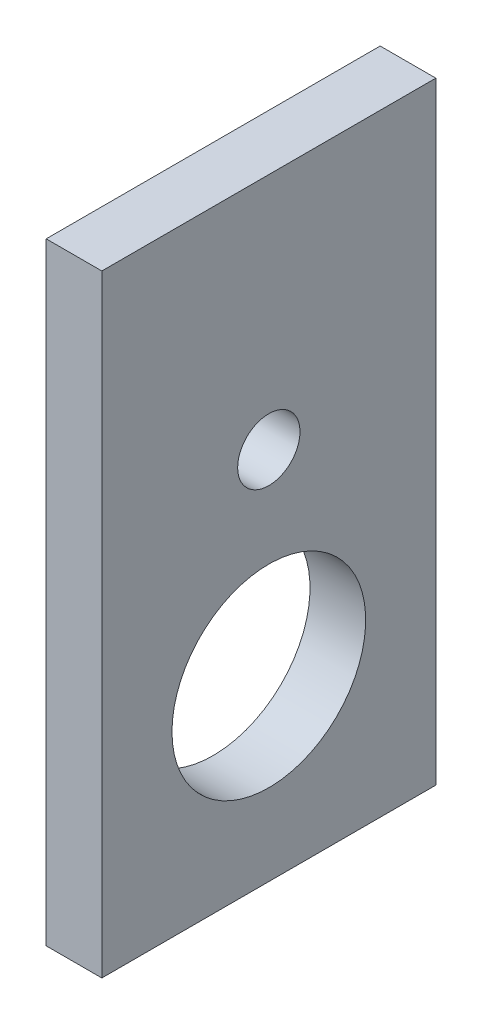
ISO-10303-21;
HEADER;
FILE_DESCRIPTION(('STEP AP214'),'2;1');
FILE_NAME('part.step','',(''),(''),'','','');
FILE_SCHEMA(('AUTOMOTIVE_DESIGN { 1 0 10303 214 1 1 1 1 }'));
ENDSEC;
DATA;
#1=APPLICATION_CONTEXT('core data for automotive mechanical design processes');
#2=APPLICATION_PROTOCOL_DEFINITION('international standard','automotive_design',2000,#1);
#3=PRODUCT_CONTEXT('',#1,'mechanical');
#4=PRODUCT('Part','Part','',(#3));
#5=PRODUCT_RELATED_PRODUCT_CATEGORY('part','',(#4));
#6=PRODUCT_DEFINITION_FORMATION('','',#4);
#7=PRODUCT_DEFINITION_CONTEXT('part definition',#1,'design');
#8=PRODUCT_DEFINITION('design','',#6,#7);
#9=PRODUCT_DEFINITION_SHAPE('','',#8);
#10=(LENGTH_UNIT() NAMED_UNIT(*) SI_UNIT(.MILLI.,.METRE.));
#11=(NAMED_UNIT(*) PLANE_ANGLE_UNIT() SI_UNIT($,.RADIAN.));
#12=(NAMED_UNIT(*) SI_UNIT($,.STERADIAN.) SOLID_ANGLE_UNIT());
#13=UNCERTAINTY_MEASURE_WITH_UNIT(LENGTH_MEASURE(1.E-05),#10,'distance_accuracy_value','');
#14=(GEOMETRIC_REPRESENTATION_CONTEXT(3) GLOBAL_UNCERTAINTY_ASSIGNED_CONTEXT((#13)) GLOBAL_UNIT_ASSIGNED_CONTEXT((#10,
#11,#12)) REPRESENTATION_CONTEXT('',''));
#15=CARTESIAN_POINT('',(0.,0.,0.));
#16=DIRECTION('',(0.,0.,1.));
#17=DIRECTION('',(1.,0.,0.));
#18=AXIS2_PLACEMENT_3D('',#15,#16,#17);
#19=CARTESIAN_POINT('',(0.,0.,38.1));
#20=DIRECTION('',(0.,1.,0.));
#21=DIRECTION('',(0.,0.,1.));
#22=AXIS2_PLACEMENT_3D('',#19,#20,#21);
#23=PLANE('',#22);
#24=DIRECTION('',(1.,0.,0.));
#25=VECTOR('',#24,1.);
#26=CARTESIAN_POINT('',(0.,0.,0.));
#27=LINE('',#26,#25);
#28=CARTESIAN_POINT('',(0.,0.,0.));
#29=VERTEX_POINT('',#28);
#30=CARTESIAN_POINT('',(6.35,0.,0.));
#31=VERTEX_POINT('',#30);
#32=EDGE_CURVE('E69',#29,#31,#27,.T.);
#33=ORIENTED_EDGE('',*,*,#32,.T.);
#34=DIRECTION('',(0.,0.,-1.));
#35=VECTOR('',#34,1.);
#36=CARTESIAN_POINT('',(6.35,0.,38.1));
#37=LINE('',#36,#35);
#38=CARTESIAN_POINT('',(6.35,0.,38.1));
#39=VERTEX_POINT('',#38);
#40=EDGE_CURVE('E41',#39,#31,#37,.T.);
#41=ORIENTED_EDGE('',*,*,#40,.F.);
#42=DIRECTION('',(1.,0.,0.));
#43=VECTOR('',#42,1.);
#44=CARTESIAN_POINT('',(0.,0.,38.1));
#45=LINE('',#44,#43);
#46=CARTESIAN_POINT('',(0.,0.,38.1));
#47=VERTEX_POINT('',#46);
#48=EDGE_CURVE('E71',#47,#39,#45,.T.);
#49=ORIENTED_EDGE('',*,*,#48,.F.);
#50=DIRECTION('',(0.,0.,-1.));
#51=VECTOR('',#50,1.);
#52=CARTESIAN_POINT('',(0.,0.,38.1));
#53=LINE('',#52,#51);
#54=EDGE_CURVE('E49',#47,#29,#53,.T.);
#55=ORIENTED_EDGE('',*,*,#54,.T.);
#56=EDGE_LOOP('',(#33,#41,#49,#55));
#57=FACE_BOUND('',#56,.T.);
#58=ADVANCED_FACE('F33',(#57),#23,.F.);
#59=CARTESIAN_POINT('',(6.35,0.,38.1));
#60=DIRECTION('',(-1.,0.,0.));
#61=DIRECTION('',(0.,0.,1.));
#62=AXIS2_PLACEMENT_3D('',#59,#60,#61);
#63=PLANE('',#62);
#64=CARTESIAN_POINT('',(6.35,42.672,19.05));
#65=DIRECTION('',(-1.,0.,0.));
#66=DIRECTION('',(0.,0.,1.));
#67=AXIS2_PLACEMENT_3D('',#64,#65,#66);
#68=CIRCLE('',#67,3.55600000000001);
#69=CARTESIAN_POINT('',(6.35,42.672,22.606));
#70=VERTEX_POINT('',#69);
#71=EDGE_CURVE('E109',#70,#70,#68,.T.);
#72=ORIENTED_EDGE('',*,*,#71,.T.);
#73=EDGE_LOOP('',(#72));
#74=FACE_BOUND('',#73,.T.);
#75=CARTESIAN_POINT('',(6.35,20.32,19.05));
#76=DIRECTION('',(-1.,0.,0.));
#77=DIRECTION('',(0.,0.,1.));
#78=AXIS2_PLACEMENT_3D('',#75,#76,#77);
#79=CIRCLE('',#78,11.049);
#80=CARTESIAN_POINT('',(6.35,20.32,30.099));
#81=VERTEX_POINT('',#80);
#82=EDGE_CURVE('E83',#81,#81,#79,.T.);
#83=ORIENTED_EDGE('',*,*,#82,.T.);
#84=EDGE_LOOP('',(#83));
#85=FACE_BOUND('',#84,.T.);
#86=DIRECTION('',(0.,1.,0.));
#87=VECTOR('',#86,1.);
#88=CARTESIAN_POINT('',(6.35,0.,0.));
#89=LINE('',#88,#87);
#90=CARTESIAN_POINT('',(6.35,69.85,0.));
#91=VERTEX_POINT('',#90);
#92=EDGE_CURVE('E81',#31,#91,#89,.T.);
#93=ORIENTED_EDGE('',*,*,#92,.T.);
#94=DIRECTION('',(0.,0.,-1.));
#95=VECTOR('',#94,1.);
#96=CARTESIAN_POINT('',(6.35,69.85,38.1));
#97=LINE('',#96,#95);
#98=CARTESIAN_POINT('',(6.34999999999999,69.85,38.1));
#99=VERTEX_POINT('',#98);
#100=EDGE_CURVE('E64',#99,#91,#97,.T.);
#101=ORIENTED_EDGE('',*,*,#100,.F.);
#102=DIRECTION('',(0.,1.,0.));
#103=VECTOR('',#102,1.);
#104=CARTESIAN_POINT('',(6.35,0.,38.1));
#105=LINE('',#104,#103);
#106=EDGE_CURVE('E91',#39,#99,#105,.T.);
#107=ORIENTED_EDGE('',*,*,#106,.F.);
#108=ORIENTED_EDGE('',*,*,#40,.T.);
#109=EDGE_LOOP('',(#93,#101,#107,#108));
#110=FACE_BOUND('',#109,.T.);
#111=ADVANCED_FACE('F96',(#74,#85,#110),#63,.F.);
#112=CARTESIAN_POINT('',(0.,0.,38.1));
#113=DIRECTION('',(-1.,0.,0.));
#114=DIRECTION('',(0.,0.,1.));
#115=AXIS2_PLACEMENT_3D('',#112,#113,#114);
#116=PLANE('',#115);
#117=DIRECTION('',(0.,0.,1.));
#118=VECTOR('',#117,1.);
#119=CARTESIAN_POINT('',(0.,69.85,-38.1));
#120=LINE('',#119,#118);
#121=CARTESIAN_POINT('',(0.,69.85,0.));
#122=VERTEX_POINT('',#121);
#123=CARTESIAN_POINT('',(0.,69.85,38.1));
#124=VERTEX_POINT('',#123);
#125=EDGE_CURVE('E89',#122,#124,#120,.T.);
#126=ORIENTED_EDGE('',*,*,#125,.F.);
#127=DIRECTION('',(0.,1.,0.));
#128=VECTOR('',#127,1.);
#129=CARTESIAN_POINT('',(0.,0.,0.));
#130=LINE('',#129,#128);
#131=EDGE_CURVE('E79',#29,#122,#130,.T.);
#132=ORIENTED_EDGE('',*,*,#131,.F.);
#133=ORIENTED_EDGE('',*,*,#54,.F.);
#134=DIRECTION('',(0.,1.,0.));
#135=VECTOR('',#134,1.);
#136=CARTESIAN_POINT('',(0.,0.,38.1));
#137=LINE('',#136,#135);
#138=EDGE_CURVE('E73',#47,#124,#137,.T.);
#139=ORIENTED_EDGE('',*,*,#138,.T.);
#140=EDGE_LOOP('',(#126,#132,#133,#139));
#141=FACE_BOUND('',#140,.T.);
#142=CARTESIAN_POINT('',(0.,42.672,19.05));
#143=DIRECTION('',(-1.,0.,0.));
#144=DIRECTION('',(0.,0.,1.));
#145=AXIS2_PLACEMENT_3D('',#142,#143,#144);
#146=CIRCLE('',#145,3.55600000000001);
#147=CARTESIAN_POINT('',(0.,42.672,22.606));
#148=VERTEX_POINT('',#147);
#149=EDGE_CURVE('E112',#148,#148,#146,.T.);
#150=ORIENTED_EDGE('',*,*,#149,.F.);
#151=EDGE_LOOP('',(#150));
#152=FACE_BOUND('',#151,.T.);
#153=CARTESIAN_POINT('',(0.,20.32,19.05));
#154=DIRECTION('',(-1.,0.,0.));
#155=DIRECTION('',(0.,0.,1.));
#156=AXIS2_PLACEMENT_3D('',#153,#154,#155);
#157=CIRCLE('',#156,11.049);
#158=CARTESIAN_POINT('',(0.,20.32,30.099));
#159=VERTEX_POINT('',#158);
#160=EDGE_CURVE('E106',#159,#159,#157,.T.);
#161=ORIENTED_EDGE('',*,*,#160,.F.);
#162=EDGE_LOOP('',(#161));
#163=FACE_BOUND('',#162,.T.);
#164=ADVANCED_FACE('F86',(#141,#152,#163),#116,.T.);
#165=CARTESIAN_POINT('',(0.,0.,38.1));
#166=DIRECTION('',(0.,0.,1.));
#167=DIRECTION('',(1.,0.,0.));
#168=AXIS2_PLACEMENT_3D('',#165,#166,#167);
#169=PLANE('',#168);
#170=DIRECTION('',(1.,0.,0.));
#171=VECTOR('',#170,1.);
#172=CARTESIAN_POINT('',(94.447991823564,69.85,38.1));
#173=LINE('',#172,#171);
#174=EDGE_CURVE('E103',#124,#99,#173,.T.);
#175=ORIENTED_EDGE('',*,*,#174,.F.);
#176=ORIENTED_EDGE('',*,*,#138,.F.);
#177=ORIENTED_EDGE('',*,*,#48,.T.);
#178=ORIENTED_EDGE('',*,*,#106,.T.);
#179=EDGE_LOOP('',(#175,#176,#177,#178));
#180=FACE_BOUND('',#179,.T.);
#181=ADVANCED_FACE('F101',(#180),#169,.T.);
#182=CARTESIAN_POINT('',(0.,0.,0.));
#183=DIRECTION('',(0.,0.,1.));
#184=DIRECTION('',(1.,0.,0.));
#185=AXIS2_PLACEMENT_3D('',#182,#183,#184);
#186=PLANE('',#185);
#187=ORIENTED_EDGE('',*,*,#131,.T.);
#188=DIRECTION('',(1.,0.,0.));
#189=VECTOR('',#188,1.);
#190=CARTESIAN_POINT('',(0.,69.85,0.));
#191=LINE('',#190,#189);
#192=EDGE_CURVE('E11',#122,#91,#191,.T.);
#193=ORIENTED_EDGE('',*,*,#192,.T.);
#194=ORIENTED_EDGE('',*,*,#92,.F.);
#195=ORIENTED_EDGE('',*,*,#32,.F.);
#196=EDGE_LOOP('',(#187,#193,#194,#195));
#197=FACE_BOUND('',#196,.T.);
#198=ADVANCED_FACE('F77',(#197),#186,.F.);
#199=CARTESIAN_POINT('',(6.35,20.32,19.05));
#200=DIRECTION('',(-1.,0.,0.));
#201=DIRECTION('',(0.,0.,1.));
#202=AXIS2_PLACEMENT_3D('',#199,#200,#201);
#203=CYLINDRICAL_SURFACE('',#202,11.049);
#204=ORIENTED_EDGE('',*,*,#82,.F.);
#205=EDGE_LOOP('',(#204));
#206=FACE_BOUND('',#205,.T.);
#207=ORIENTED_EDGE('',*,*,#160,.T.);
#208=EDGE_LOOP('',(#207));
#209=FACE_BOUND('',#208,.T.);
#210=ADVANCED_FACE('F127',(#206,#209),#203,.F.);
#211=CARTESIAN_POINT('',(6.35,42.672,19.05));
#212=DIRECTION('',(-1.,0.,0.));
#213=DIRECTION('',(0.,0.,1.));
#214=AXIS2_PLACEMENT_3D('',#211,#212,#213);
#215=CYLINDRICAL_SURFACE('',#214,3.55600000000001);
#216=ORIENTED_EDGE('',*,*,#71,.F.);
#217=EDGE_LOOP('',(#216));
#218=FACE_BOUND('',#217,.T.);
#219=ORIENTED_EDGE('',*,*,#149,.T.);
#220=EDGE_LOOP('',(#219));
#221=FACE_BOUND('',#220,.T.);
#222=ADVANCED_FACE('F122',(#218,#221),#215,.F.);
#223=CARTESIAN_POINT('',(94.447991823564,69.85,-38.1));
#224=DIRECTION('',(0.,-1.,0.));
#225=DIRECTION('',(0.,0.,-1.));
#226=AXIS2_PLACEMENT_3D('',#223,#224,#225);
#227=PLANE('',#226);
#228=ORIENTED_EDGE('',*,*,#192,.F.);
#229=ORIENTED_EDGE('',*,*,#125,.T.);
#230=ORIENTED_EDGE('',*,*,#174,.T.);
#231=ORIENTED_EDGE('',*,*,#100,.T.);
#232=EDGE_LOOP('',(#228,#229,#230,#231));
#233=FACE_BOUND('',#232,.T.);
#234=ADVANCED_FACE('F118',(#233),#227,.F.);
#235=CLOSED_SHELL('',(#58,#111,#164,#181,#198,#210,#222,#234));
#236=MANIFOLD_SOLID_BREP('B2',#235);
#237=ADVANCED_BREP_SHAPE_REPRESENTATION('',(#18,#236),#14);
#238=SHAPE_DEFINITION_REPRESENTATION(#9,#237);
ENDSEC;
END-ISO-10303-21;
